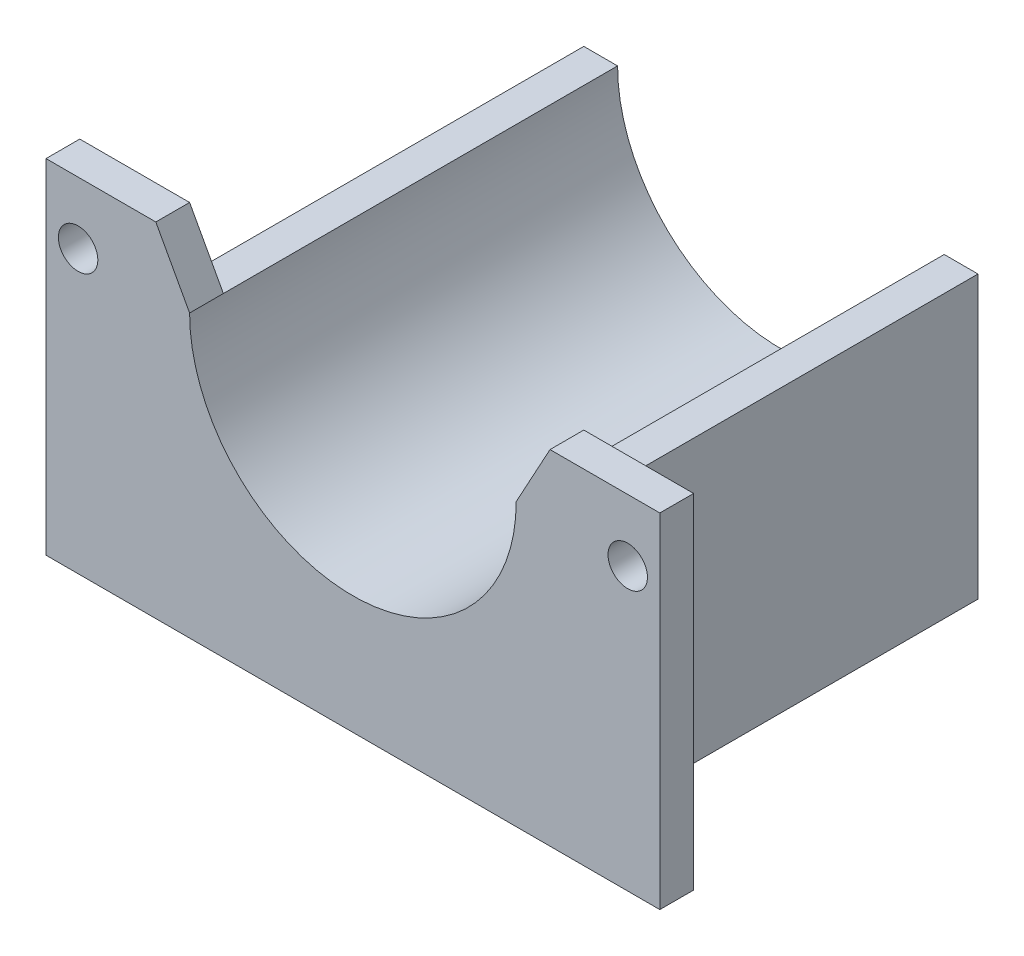
ISO-10303-21;
HEADER;
FILE_DESCRIPTION(('STEP AP214'),'2;1');
FILE_NAME('part.step','',(''),(''),'','','');
FILE_SCHEMA(('AUTOMOTIVE_DESIGN { 1 0 10303 214 1 1 1 1 }'));
ENDSEC;
DATA;
#1=APPLICATION_CONTEXT('core data for automotive mechanical design processes');
#2=APPLICATION_PROTOCOL_DEFINITION('international standard','automotive_design',2000,#1);
#3=PRODUCT_CONTEXT('',#1,'mechanical');
#4=PRODUCT('Part','Part','',(#3));
#5=PRODUCT_RELATED_PRODUCT_CATEGORY('part','',(#4));
#6=PRODUCT_DEFINITION_FORMATION('','',#4);
#7=PRODUCT_DEFINITION_CONTEXT('part definition',#1,'design');
#8=PRODUCT_DEFINITION('design','',#6,#7);
#9=PRODUCT_DEFINITION_SHAPE('','',#8);
#10=(LENGTH_UNIT() NAMED_UNIT(*) SI_UNIT(.MILLI.,.METRE.));
#11=(NAMED_UNIT(*) PLANE_ANGLE_UNIT() SI_UNIT($,.RADIAN.));
#12=(NAMED_UNIT(*) SI_UNIT($,.STERADIAN.) SOLID_ANGLE_UNIT());
#13=UNCERTAINTY_MEASURE_WITH_UNIT(LENGTH_MEASURE(1.E-05),#10,'distance_accuracy_value','');
#14=(GEOMETRIC_REPRESENTATION_CONTEXT(3) GLOBAL_UNCERTAINTY_ASSIGNED_CONTEXT((#13)) GLOBAL_UNIT_ASSIGNED_CONTEXT((#10,
#11,#12)) REPRESENTATION_CONTEXT('',''));
#15=CARTESIAN_POINT('',(0.,0.,0.));
#16=DIRECTION('',(0.,0.,1.));
#17=DIRECTION('',(1.,0.,0.));
#18=AXIS2_PLACEMENT_3D('',#15,#16,#17);
#19=CARTESIAN_POINT('',(0.,0.,35.));
#20=DIRECTION('',(0.,0.,-1.));
#21=DIRECTION('',(-1.,0.,0.));
#22=AXIS2_PLACEMENT_3D('',#19,#20,#21);
#23=PLANE('',#22);
#24=DIRECTION('',(-0.478852130680573,-0.877895572914385,0.));
#25=VECTOR('',#24,1.);
#26=CARTESIAN_POINT('',(-3.,0.,35.));
#27=LINE('',#26,#25);
#28=CARTESIAN_POINT('',(0.,5.50000000000001,35.));
#29=VERTEX_POINT('',#28);
#30=CARTESIAN_POINT('',(-3.,0.,35.));
#31=VERTEX_POINT('',#30);
#32=EDGE_CURVE('E171',#29,#31,#27,.T.);
#33=ORIENTED_EDGE('',*,*,#32,.F.);
#34=DIRECTION('',(-1.,0.,0.));
#35=VECTOR('',#34,1.);
#36=CARTESIAN_POINT('',(-44.75,5.5,35.));
#37=LINE('',#36,#35);
#38=CARTESIAN_POINT('',(9.74999999999999,5.50000000000001,35.));
#39=VERTEX_POINT('',#38);
#40=EDGE_CURVE('E211',#39,#29,#37,.T.);
#41=ORIENTED_EDGE('',*,*,#40,.F.);
#42=DIRECTION('',(0.,1.,0.));
#43=VECTOR('',#42,1.);
#44=CARTESIAN_POINT('',(9.75,-25.,35.));
#45=LINE('',#44,#43);
#46=CARTESIAN_POINT('',(9.75,-25.,35.));
#47=VERTEX_POINT('',#46);
#48=EDGE_CURVE('E230',#47,#39,#45,.T.);
#49=ORIENTED_EDGE('',*,*,#48,.F.);
#50=DIRECTION('',(1.,0.,0.));
#51=VECTOR('',#50,1.);
#52=CARTESIAN_POINT('',(-44.75,-25.,35.));
#53=LINE('',#52,#51);
#54=CARTESIAN_POINT('',(0.,-25.,35.));
#55=VERTEX_POINT('',#54);
#56=EDGE_CURVE('E225',#55,#47,#53,.T.);
#57=ORIENTED_EDGE('',*,*,#56,.F.);
#58=DIRECTION('',(0.,1.,0.));
#59=VECTOR('',#58,1.);
#60=CARTESIAN_POINT('',(0.,0.,35.));
#61=LINE('',#60,#59);
#62=CARTESIAN_POINT('',(0.,0.,35.));
#63=VERTEX_POINT('',#62);
#64=EDGE_CURVE('E253',#55,#63,#61,.T.);
#65=ORIENTED_EDGE('',*,*,#64,.T.);
#66=DIRECTION('',(-1.,0.,0.));
#67=VECTOR('',#66,1.);
#68=CARTESIAN_POINT('',(0.,0.,35.));
#69=LINE('',#68,#67);
#70=EDGE_CURVE('E98',#63,#31,#69,.T.);
#71=ORIENTED_EDGE('',*,*,#70,.T.);
#72=EDGE_LOOP('',(#33,#41,#49,#57,#65,#71));
#73=FACE_BOUND('',#72,.T.);
#74=CARTESIAN_POINT('',(6.9,0.,35.));
#75=DIRECTION('',(0.,0.,1.));
#76=DIRECTION('',(1.,0.,0.));
#77=AXIS2_PLACEMENT_3D('',#74,#75,#76);
#78=CIRCLE('',#77,1.75);
#79=CARTESIAN_POINT('',(8.65,0.,35.));
#80=VERTEX_POINT('',#79);
#81=EDGE_CURVE('E194',#80,#80,#78,.T.);
#82=ORIENTED_EDGE('',*,*,#81,.T.);
#83=EDGE_LOOP('',(#82));
#84=FACE_BOUND('',#83,.T.);
#85=ADVANCED_FACE('F43',(#73,#84),#23,.T.);
#86=CARTESIAN_POINT('',(-44.75,5.5,38.));
#87=DIRECTION('',(0.,-1.,0.));
#88=DIRECTION('',(1.,0.,0.));
#89=AXIS2_PLACEMENT_3D('',#86,#87,#88);
#90=PLANE('',#89);
#91=ORIENTED_EDGE('',*,*,#40,.T.);
#92=DIRECTION('',(0.,0.,-1.));
#93=VECTOR('',#92,1.);
#94=CARTESIAN_POINT('',(0.,5.50000000000001,38.));
#95=LINE('',#94,#93);
#96=CARTESIAN_POINT('',(0.,5.50000000000001,38.));
#97=VERTEX_POINT('',#96);
#98=EDGE_CURVE('E185',#97,#29,#95,.T.);
#99=ORIENTED_EDGE('',*,*,#98,.F.);
#100=DIRECTION('',(-1.,0.,0.));
#101=VECTOR('',#100,1.);
#102=CARTESIAN_POINT('',(-44.75,5.5,38.));
#103=LINE('',#102,#101);
#104=CARTESIAN_POINT('',(9.74999999999999,5.50000000000001,38.));
#105=VERTEX_POINT('',#104);
#106=EDGE_CURVE('E218',#105,#97,#103,.T.);
#107=ORIENTED_EDGE('',*,*,#106,.F.);
#108=DIRECTION('',(0.,0.,-1.));
#109=VECTOR('',#108,1.);
#110=CARTESIAN_POINT('',(9.74999999999999,5.50000000000001,38.));
#111=LINE('',#110,#109);
#112=EDGE_CURVE('E240',#105,#39,#111,.T.);
#113=ORIENTED_EDGE('',*,*,#112,.T.);
#114=EDGE_LOOP('',(#91,#99,#107,#113));
#115=FACE_BOUND('',#114,.T.);
#116=ADVANCED_FACE('F330',(#115),#90,.F.);
#117=CARTESIAN_POINT('',(0.,0.,35.));
#118=DIRECTION('',(-1.,0.,0.));
#119=DIRECTION('',(0.,-1.,0.));
#120=AXIS2_PLACEMENT_3D('',#117,#118,#119);
#121=PLANE('',#120);
#122=DIRECTION('',(0.,1.,0.));
#123=VECTOR('',#122,1.);
#124=CARTESIAN_POINT('',(0.,0.,0.));
#125=LINE('',#124,#123);
#126=CARTESIAN_POINT('',(0.,-25.,0.));
#127=VERTEX_POINT('',#126);
#128=CARTESIAN_POINT('',(0.,0.,0.));
#129=VERTEX_POINT('',#128);
#130=EDGE_CURVE('E252',#127,#129,#125,.T.);
#131=ORIENTED_EDGE('',*,*,#130,.T.);
#132=DIRECTION('',(0.,0.,-1.));
#133=VECTOR('',#132,1.);
#134=CARTESIAN_POINT('',(0.,0.,35.));
#135=LINE('',#134,#133);
#136=EDGE_CURVE('E11',#63,#129,#135,.T.);
#137=ORIENTED_EDGE('',*,*,#136,.F.);
#138=ORIENTED_EDGE('',*,*,#64,.F.);
#139=DIRECTION('',(0.,0.,-1.));
#140=VECTOR('',#139,1.);
#141=CARTESIAN_POINT('',(0.,-25.,35.));
#142=LINE('',#141,#140);
#143=EDGE_CURVE('E68',#55,#127,#142,.T.);
#144=ORIENTED_EDGE('',*,*,#143,.T.);
#145=EDGE_LOOP('',(#131,#137,#138,#144));
#146=FACE_BOUND('',#145,.T.);
#147=ADVANCED_FACE('F45',(#146),#121,.F.);
#148=CARTESIAN_POINT('',(0.,0.,35.));
#149=DIRECTION('',(0.,-1.,0.));
#150=DIRECTION('',(0.,0.,-1.));
#151=AXIS2_PLACEMENT_3D('',#148,#149,#150);
#152=PLANE('',#151);
#153=DIRECTION('',(-1.,0.,0.));
#154=VECTOR('',#153,1.);
#155=CARTESIAN_POINT('',(0.,0.,0.));
#156=LINE('',#155,#154);
#157=CARTESIAN_POINT('',(-3.,0.,0.));
#158=VERTEX_POINT('',#157);
#159=EDGE_CURVE('E270',#129,#158,#156,.T.);
#160=ORIENTED_EDGE('',*,*,#159,.T.);
#161=DIRECTION('',(0.,0.,-1.));
#162=VECTOR('',#161,1.);
#163=CARTESIAN_POINT('',(-3.,0.,35.));
#164=LINE('',#163,#162);
#165=EDGE_CURVE('E52',#31,#158,#164,.T.);
#166=ORIENTED_EDGE('',*,*,#165,.F.);
#167=ORIENTED_EDGE('',*,*,#70,.F.);
#168=ORIENTED_EDGE('',*,*,#136,.T.);
#169=EDGE_LOOP('',(#160,#166,#167,#168));
#170=FACE_BOUND('',#169,.T.);
#171=ADVANCED_FACE('F400',(#170),#152,.F.);
#172=CARTESIAN_POINT('',(-17.5,0.,35.));
#173=DIRECTION('',(0.,0.,-1.));
#174=DIRECTION('',(-1.,0.,0.));
#175=AXIS2_PLACEMENT_3D('',#172,#173,#174);
#176=CYLINDRICAL_SURFACE('',#175,14.5);
#177=CARTESIAN_POINT('',(-17.5,0.,0.));
#178=DIRECTION('',(0.,0.,-1.));
#179=DIRECTION('',(1.,0.,0.));
#180=AXIS2_PLACEMENT_3D('',#177,#178,#179);
#181=CIRCLE('',#180,14.5);
#182=CARTESIAN_POINT('',(-32.,0.,0.));
#183=VERTEX_POINT('',#182);
#184=EDGE_CURVE('E273',#158,#183,#181,.T.);
#185=ORIENTED_EDGE('',*,*,#184,.T.);
#186=DIRECTION('',(0.,0.,-1.));
#187=VECTOR('',#186,1.);
#188=CARTESIAN_POINT('',(-32.,0.,35.));
#189=LINE('',#188,#187);
#190=CARTESIAN_POINT('',(-32.,0.,35.));
#191=VERTEX_POINT('',#190);
#192=EDGE_CURVE('E154',#191,#183,#189,.T.);
#193=ORIENTED_EDGE('',*,*,#192,.F.);
#194=DIRECTION('',(0.,0.,-1.));
#195=VECTOR('',#194,1.);
#196=CARTESIAN_POINT('',(-32.,0.,38.));
#197=LINE('',#196,#195);
#198=CARTESIAN_POINT('',(-32.,0.,38.));
#199=VERTEX_POINT('',#198);
#200=EDGE_CURVE('E147',#199,#191,#197,.T.);
#201=ORIENTED_EDGE('',*,*,#200,.F.);
#202=CARTESIAN_POINT('',(-17.5,0.,38.));
#203=DIRECTION('',(0.,0.,-1.));
#204=DIRECTION('',(-1.,0.,0.));
#205=AXIS2_PLACEMENT_3D('',#202,#203,#204);
#206=CIRCLE('',#205,14.5);
#207=CARTESIAN_POINT('',(-3.,0.,38.));
#208=VERTEX_POINT('',#207);
#209=EDGE_CURVE('E151',#208,#199,#206,.T.);
#210=ORIENTED_EDGE('',*,*,#209,.F.);
#211=DIRECTION('',(0.,0.,-1.));
#212=VECTOR('',#211,1.);
#213=CARTESIAN_POINT('',(-3.,0.,38.));
#214=LINE('',#213,#212);
#215=EDGE_CURVE('E181',#208,#31,#214,.T.);
#216=ORIENTED_EDGE('',*,*,#215,.T.);
#217=ORIENTED_EDGE('',*,*,#165,.T.);
#218=EDGE_LOOP('',(#185,#193,#201,#210,#216,#217));
#219=FACE_BOUND('',#218,.T.);
#220=ADVANCED_FACE('F149',(#219),#176,.F.);
#221=CARTESIAN_POINT('',(-32.,0.,35.));
#222=DIRECTION('',(0.,-1.,0.));
#223=DIRECTION('',(0.,0.,-1.));
#224=AXIS2_PLACEMENT_3D('',#221,#222,#223);
#225=PLANE('',#224);
#226=DIRECTION('',(-1.,0.,0.));
#227=VECTOR('',#226,1.);
#228=CARTESIAN_POINT('',(-32.,0.,0.));
#229=LINE('',#228,#227);
#230=CARTESIAN_POINT('',(-35.,0.,0.));
#231=VERTEX_POINT('',#230);
#232=EDGE_CURVE('E276',#183,#231,#229,.T.);
#233=ORIENTED_EDGE('',*,*,#232,.T.);
#234=DIRECTION('',(0.,0.,-1.));
#235=VECTOR('',#234,1.);
#236=CARTESIAN_POINT('',(-35.,0.,35.));
#237=LINE('',#236,#235);
#238=CARTESIAN_POINT('',(-35.,0.,35.));
#239=VERTEX_POINT('',#238);
#240=EDGE_CURVE('E289',#239,#231,#237,.T.);
#241=ORIENTED_EDGE('',*,*,#240,.F.);
#242=DIRECTION('',(-1.,0.,0.));
#243=VECTOR('',#242,1.);
#244=CARTESIAN_POINT('',(-32.,0.,35.));
#245=LINE('',#244,#243);
#246=EDGE_CURVE('E259',#191,#239,#245,.T.);
#247=ORIENTED_EDGE('',*,*,#246,.F.);
#248=ORIENTED_EDGE('',*,*,#192,.T.);
#249=EDGE_LOOP('',(#233,#241,#247,#248));
#250=FACE_BOUND('',#249,.T.);
#251=ADVANCED_FACE('F303',(#250),#225,.F.);
#252=CARTESIAN_POINT('',(-35.,0.,35.));
#253=DIRECTION('',(1.,0.,0.));
#254=DIRECTION('',(0.,0.,-1.));
#255=AXIS2_PLACEMENT_3D('',#252,#253,#254);
#256=PLANE('',#255);
#257=DIRECTION('',(0.,-1.,0.));
#258=VECTOR('',#257,1.);
#259=CARTESIAN_POINT('',(-35.,0.,0.));
#260=LINE('',#259,#258);
#261=CARTESIAN_POINT('',(-35.,-25.,0.));
#262=VERTEX_POINT('',#261);
#263=EDGE_CURVE('E279',#231,#262,#260,.T.);
#264=ORIENTED_EDGE('',*,*,#263,.T.);
#265=DIRECTION('',(0.,0.,-1.));
#266=VECTOR('',#265,1.);
#267=CARTESIAN_POINT('',(-35.,-25.,35.));
#268=LINE('',#267,#266);
#269=CARTESIAN_POINT('',(-35.,-25.,35.));
#270=VERTEX_POINT('',#269);
#271=EDGE_CURVE('E286',#270,#262,#268,.T.);
#272=ORIENTED_EDGE('',*,*,#271,.F.);
#273=DIRECTION('',(0.,-1.,0.));
#274=VECTOR('',#273,1.);
#275=CARTESIAN_POINT('',(-35.,0.,35.));
#276=LINE('',#275,#274);
#277=EDGE_CURVE('E263',#239,#270,#276,.T.);
#278=ORIENTED_EDGE('',*,*,#277,.F.);
#279=ORIENTED_EDGE('',*,*,#240,.T.);
#280=EDGE_LOOP('',(#264,#272,#278,#279));
#281=FACE_BOUND('',#280,.T.);
#282=ADVANCED_FACE('F306',(#281),#256,.F.);
#283=CARTESIAN_POINT('',(0.,-25.,35.));
#284=DIRECTION('',(0.,1.,0.));
#285=DIRECTION('',(-1.,0.,0.));
#286=AXIS2_PLACEMENT_3D('',#283,#284,#285);
#287=PLANE('',#286);
#288=DIRECTION('',(1.,0.,0.));
#289=VECTOR('',#288,1.);
#290=CARTESIAN_POINT('',(0.,-25.,0.));
#291=LINE('',#290,#289);
#292=EDGE_CURVE('E93',#262,#127,#291,.T.);
#293=ORIENTED_EDGE('',*,*,#292,.T.);
#294=ORIENTED_EDGE('',*,*,#143,.F.);
#295=ORIENTED_EDGE('',*,*,#56,.T.);
#296=DIRECTION('',(0.,0.,-1.));
#297=VECTOR('',#296,1.);
#298=CARTESIAN_POINT('',(9.75,-25.,38.));
#299=LINE('',#298,#297);
#300=CARTESIAN_POINT('',(9.75,-25.,38.));
#301=VERTEX_POINT('',#300);
#302=EDGE_CURVE('E244',#301,#47,#299,.T.);
#303=ORIENTED_EDGE('',*,*,#302,.F.);
#304=DIRECTION('',(1.,0.,0.));
#305=VECTOR('',#304,1.);
#306=CARTESIAN_POINT('',(-44.75,-25.,38.));
#307=LINE('',#306,#305);
#308=CARTESIAN_POINT('',(-44.75,-25.,38.));
#309=VERTEX_POINT('',#308);
#310=EDGE_CURVE('E210',#309,#301,#307,.T.);
#311=ORIENTED_EDGE('',*,*,#310,.F.);
#312=DIRECTION('',(0.,0.,-1.));
#313=VECTOR('',#312,1.);
#314=CARTESIAN_POINT('',(-44.75,-25.,38.));
#315=LINE('',#314,#313);
#316=CARTESIAN_POINT('',(-44.75,-25.,35.));
#317=VERTEX_POINT('',#316);
#318=EDGE_CURVE('E248',#309,#317,#315,.T.);
#319=ORIENTED_EDGE('',*,*,#318,.T.);
#320=EDGE_CURVE('E226',#317,#270,#53,.T.);
#321=ORIENTED_EDGE('',*,*,#320,.T.);
#322=ORIENTED_EDGE('',*,*,#271,.T.);
#323=EDGE_LOOP('',(#293,#294,#295,#303,#311,#319,#321,#322));
#324=FACE_BOUND('',#323,.T.);
#325=ADVANCED_FACE('F318',(#324),#287,.F.);
#326=CARTESIAN_POINT('',(-17.5,0.,0.));
#327=DIRECTION('',(0.,0.,1.));
#328=DIRECTION('',(1.,0.,0.));
#329=AXIS2_PLACEMENT_3D('',#326,#327,#328);
#330=PLANE('',#329);
#331=ORIENTED_EDGE('',*,*,#130,.F.);
#332=ORIENTED_EDGE('',*,*,#292,.F.);
#333=ORIENTED_EDGE('',*,*,#263,.F.);
#334=ORIENTED_EDGE('',*,*,#232,.F.);
#335=ORIENTED_EDGE('',*,*,#184,.F.);
#336=ORIENTED_EDGE('',*,*,#159,.F.);
#337=EDGE_LOOP('',(#331,#332,#333,#334,#335,#336));
#338=FACE_BOUND('',#337,.T.);
#339=ADVANCED_FACE('F300',(#338),#330,.F.);
#340=CARTESIAN_POINT('',(0.,0.,38.));
#341=DIRECTION('',(0.,0.,-1.));
#342=DIRECTION('',(-1.,0.,0.));
#343=AXIS2_PLACEMENT_3D('',#340,#341,#342);
#344=PLANE('',#343);
#345=ORIENTED_EDGE('',*,*,#106,.T.);
#346=DIRECTION('',(-0.478852130680573,-0.877895572914385,0.));
#347=VECTOR('',#346,1.);
#348=CARTESIAN_POINT('',(-3.,0.,38.));
#349=LINE('',#348,#347);
#350=EDGE_CURVE('E158',#97,#208,#349,.T.);
#351=ORIENTED_EDGE('',*,*,#350,.T.);
#352=ORIENTED_EDGE('',*,*,#209,.T.);
#353=DIRECTION('',(-0.478852130680573,0.877895572914384,0.));
#354=VECTOR('',#353,1.);
#355=CARTESIAN_POINT('',(-35.,5.5,38.));
#356=LINE('',#355,#354);
#357=CARTESIAN_POINT('',(-35.,5.5,38.));
#358=VERTEX_POINT('',#357);
#359=EDGE_CURVE('E161',#199,#358,#356,.T.);
#360=ORIENTED_EDGE('',*,*,#359,.T.);
#361=CARTESIAN_POINT('',(-44.75,5.5,38.));
#362=VERTEX_POINT('',#361);
#363=EDGE_CURVE('E217',#358,#362,#103,.T.);
#364=ORIENTED_EDGE('',*,*,#363,.T.);
#365=DIRECTION('',(0.,-1.,0.));
#366=VECTOR('',#365,1.);
#367=CARTESIAN_POINT('',(-44.75,-25.,38.));
#368=LINE('',#367,#366);
#369=EDGE_CURVE('E206',#362,#309,#368,.T.);
#370=ORIENTED_EDGE('',*,*,#369,.T.);
#371=ORIENTED_EDGE('',*,*,#310,.T.);
#372=DIRECTION('',(0.,1.,0.));
#373=VECTOR('',#372,1.);
#374=CARTESIAN_POINT('',(9.75,-25.,38.));
#375=LINE('',#374,#373);
#376=EDGE_CURVE('E214',#301,#105,#375,.T.);
#377=ORIENTED_EDGE('',*,*,#376,.T.);
#378=EDGE_LOOP('',(#345,#351,#352,#360,#364,#370,#371,#377));
#379=FACE_BOUND('',#378,.T.);
#380=CARTESIAN_POINT('',(6.9,0.,38.));
#381=DIRECTION('',(0.,0.,1.));
#382=DIRECTION('',(1.,0.,0.));
#383=AXIS2_PLACEMENT_3D('',#380,#381,#382);
#384=CIRCLE('',#383,1.75);
#385=CARTESIAN_POINT('',(8.65,0.,38.));
#386=VERTEX_POINT('',#385);
#387=EDGE_CURVE('E198',#386,#386,#384,.T.);
#388=ORIENTED_EDGE('',*,*,#387,.F.);
#389=EDGE_LOOP('',(#388));
#390=FACE_BOUND('',#389,.T.);
#391=CARTESIAN_POINT('',(-41.9,0.,38.));
#392=DIRECTION('',(0.,0.,1.));
#393=DIRECTION('',(-1.,0.,0.));
#394=AXIS2_PLACEMENT_3D('',#391,#392,#393);
#395=CIRCLE('',#394,1.75);
#396=CARTESIAN_POINT('',(-43.65,0.,38.));
#397=VERTEX_POINT('',#396);
#398=EDGE_CURVE('E190',#397,#397,#395,.T.);
#399=ORIENTED_EDGE('',*,*,#398,.F.);
#400=EDGE_LOOP('',(#399));
#401=FACE_BOUND('',#400,.T.);
#402=ADVANCED_FACE('F168',(#379,#390,#401),#344,.F.);
#403=DIRECTION('',(-0.478852130680573,0.877895572914384,0.));
#404=VECTOR('',#403,1.);
#405=CARTESIAN_POINT('',(-35.,5.5,35.));
#406=LINE('',#405,#404);
#407=CARTESIAN_POINT('',(-35.,5.5,35.));
#408=VERTEX_POINT('',#407);
#409=EDGE_CURVE('E59',#191,#408,#406,.T.);
#410=ORIENTED_EDGE('',*,*,#409,.F.);
#411=ORIENTED_EDGE('',*,*,#246,.T.);
#412=ORIENTED_EDGE('',*,*,#277,.T.);
#413=ORIENTED_EDGE('',*,*,#320,.F.);
#414=DIRECTION('',(0.,-1.,0.));
#415=VECTOR('',#414,1.);
#416=CARTESIAN_POINT('',(-44.75,-25.,35.));
#417=LINE('',#416,#415);
#418=CARTESIAN_POINT('',(-44.75,5.5,35.));
#419=VERTEX_POINT('',#418);
#420=EDGE_CURVE('E202',#419,#317,#417,.T.);
#421=ORIENTED_EDGE('',*,*,#420,.F.);
#422=EDGE_CURVE('E233',#408,#419,#37,.T.);
#423=ORIENTED_EDGE('',*,*,#422,.F.);
#424=EDGE_LOOP('',(#410,#411,#412,#413,#421,#423));
#425=FACE_BOUND('',#424,.T.);
#426=CARTESIAN_POINT('',(-41.9,0.,35.));
#427=DIRECTION('',(0.,0.,1.));
#428=DIRECTION('',(-1.,0.,0.));
#429=AXIS2_PLACEMENT_3D('',#426,#427,#428);
#430=CIRCLE('',#429,1.75);
#431=CARTESIAN_POINT('',(-43.65,0.,35.));
#432=VERTEX_POINT('',#431);
#433=EDGE_CURVE('E184',#432,#432,#430,.T.);
#434=ORIENTED_EDGE('',*,*,#433,.T.);
#435=EDGE_LOOP('',(#434));
#436=FACE_BOUND('',#435,.T.);
#437=ADVANCED_FACE('F308',(#425,#436),#23,.T.);
#438=CARTESIAN_POINT('',(-44.75,-25.,38.));
#439=DIRECTION('',(1.,0.,0.));
#440=DIRECTION('',(0.,0.,-1.));
#441=AXIS2_PLACEMENT_3D('',#438,#439,#440);
#442=PLANE('',#441);
#443=ORIENTED_EDGE('',*,*,#420,.T.);
#444=ORIENTED_EDGE('',*,*,#318,.F.);
#445=ORIENTED_EDGE('',*,*,#369,.F.);
#446=DIRECTION('',(0.,0.,-1.));
#447=VECTOR('',#446,1.);
#448=CARTESIAN_POINT('',(-44.75,5.5,38.));
#449=LINE('',#448,#447);
#450=EDGE_CURVE('E221',#362,#419,#449,.T.);
#451=ORIENTED_EDGE('',*,*,#450,.T.);
#452=EDGE_LOOP('',(#443,#444,#445,#451));
#453=FACE_BOUND('',#452,.T.);
#454=ADVANCED_FACE('F335',(#453),#442,.F.);
#455=CARTESIAN_POINT('',(9.75,-25.,38.));
#456=DIRECTION('',(-1.,0.,0.));
#457=DIRECTION('',(0.,-1.,0.));
#458=AXIS2_PLACEMENT_3D('',#455,#456,#457);
#459=PLANE('',#458);
#460=ORIENTED_EDGE('',*,*,#48,.T.);
#461=ORIENTED_EDGE('',*,*,#112,.F.);
#462=ORIENTED_EDGE('',*,*,#376,.F.);
#463=ORIENTED_EDGE('',*,*,#302,.T.);
#464=EDGE_LOOP('',(#460,#461,#462,#463));
#465=FACE_BOUND('',#464,.T.);
#466=ADVANCED_FACE('F323',(#465),#459,.F.);
#467=ORIENTED_EDGE('',*,*,#363,.F.);
#468=DIRECTION('',(0.,0.,-1.));
#469=VECTOR('',#468,1.);
#470=CARTESIAN_POINT('',(-35.,5.5,38.));
#471=LINE('',#470,#469);
#472=EDGE_CURVE('E157',#358,#408,#471,.T.);
#473=ORIENTED_EDGE('',*,*,#472,.T.);
#474=ORIENTED_EDGE('',*,*,#422,.T.);
#475=ORIENTED_EDGE('',*,*,#450,.F.);
#476=EDGE_LOOP('',(#467,#473,#474,#475));
#477=FACE_BOUND('',#476,.T.);
#478=ADVANCED_FACE('F336',(#477),#90,.F.);
#479=CARTESIAN_POINT('',(6.9,0.,38.));
#480=DIRECTION('',(0.,0.,-1.));
#481=DIRECTION('',(-1.,0.,0.));
#482=AXIS2_PLACEMENT_3D('',#479,#480,#481);
#483=CYLINDRICAL_SURFACE('',#482,1.75);
#484=ORIENTED_EDGE('',*,*,#387,.T.);
#485=EDGE_LOOP('',(#484));
#486=FACE_BOUND('',#485,.T.);
#487=ORIENTED_EDGE('',*,*,#81,.F.);
#488=EDGE_LOOP('',(#487));
#489=FACE_BOUND('',#488,.T.);
#490=ADVANCED_FACE('F339',(#486,#489),#483,.F.);
#491=CARTESIAN_POINT('',(-41.9,0.,38.));
#492=DIRECTION('',(0.,0.,-1.));
#493=DIRECTION('',(-1.,0.,0.));
#494=AXIS2_PLACEMENT_3D('',#491,#492,#493);
#495=CYLINDRICAL_SURFACE('',#494,1.75);
#496=ORIENTED_EDGE('',*,*,#398,.T.);
#497=EDGE_LOOP('',(#496));
#498=FACE_BOUND('',#497,.T.);
#499=ORIENTED_EDGE('',*,*,#433,.F.);
#500=EDGE_LOOP('',(#499));
#501=FACE_BOUND('',#500,.T.);
#502=ADVANCED_FACE('F345',(#498,#501),#495,.F.);
#503=CARTESIAN_POINT('',(-3.,0.,38.));
#504=DIRECTION('',(0.877895572914385,-0.478852130680573,0.));
#505=DIRECTION('',(0.478852130680573,0.877895572914385,0.));
#506=AXIS2_PLACEMENT_3D('',#503,#504,#505);
#507=PLANE('',#506);
#508=ORIENTED_EDGE('',*,*,#32,.T.);
#509=ORIENTED_EDGE('',*,*,#215,.F.);
#510=ORIENTED_EDGE('',*,*,#350,.F.);
#511=ORIENTED_EDGE('',*,*,#98,.T.);
#512=EDGE_LOOP('',(#508,#509,#510,#511));
#513=FACE_BOUND('',#512,.T.);
#514=ADVANCED_FACE('F368',(#513),#507,.F.);
#515=CARTESIAN_POINT('',(-35.,5.5,38.));
#516=DIRECTION('',(-0.877895572914384,-0.478852130680573,0.));
#517=DIRECTION('',(0.478852130680574,-0.877895572914384,0.));
#518=AXIS2_PLACEMENT_3D('',#515,#516,#517);
#519=PLANE('',#518);
#520=ORIENTED_EDGE('',*,*,#409,.T.);
#521=ORIENTED_EDGE('',*,*,#472,.F.);
#522=ORIENTED_EDGE('',*,*,#359,.F.);
#523=ORIENTED_EDGE('',*,*,#200,.T.);
#524=EDGE_LOOP('',(#520,#521,#522,#523));
#525=FACE_BOUND('',#524,.T.);
#526=ADVANCED_FACE('F162',(#525),#519,.F.);
#527=CLOSED_SHELL('',(#85,#116,#147,#171,#220,#251,#282,#325,#339,#402,#437,#454,#466,#478,#490,
#502,#514,#526));
#528=MANIFOLD_SOLID_BREP('B2',#527);
#529=ADVANCED_BREP_SHAPE_REPRESENTATION('',(#18,#528),#14);
#530=SHAPE_DEFINITION_REPRESENTATION(#9,#529);
ENDSEC;
END-ISO-10303-21;
